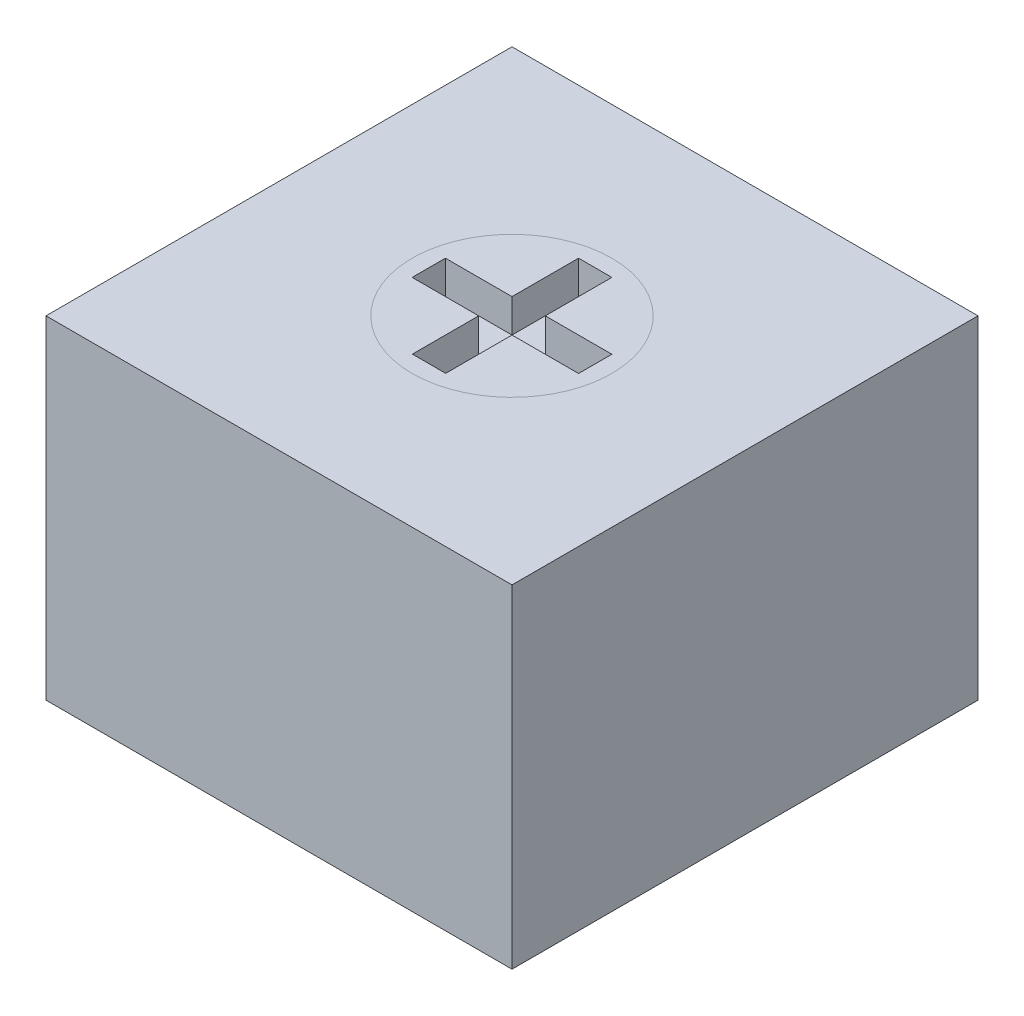
ISO-10303-21;
HEADER;
FILE_DESCRIPTION(('STEP AP214'),'2;1');
FILE_NAME('part.step','',(''),(''),'','','');
FILE_SCHEMA(('AUTOMOTIVE_DESIGN { 1 0 10303 214 1 1 1 1 }'));
ENDSEC;
DATA;
#1=APPLICATION_CONTEXT('core data for automotive mechanical design processes');
#2=APPLICATION_PROTOCOL_DEFINITION('international standard','automotive_design',2000,#1);
#3=PRODUCT_CONTEXT('',#1,'mechanical');
#4=PRODUCT('Part','Part','',(#3));
#5=PRODUCT_RELATED_PRODUCT_CATEGORY('part','',(#4));
#6=PRODUCT_DEFINITION_FORMATION('','',#4);
#7=PRODUCT_DEFINITION_CONTEXT('part definition',#1,'design');
#8=PRODUCT_DEFINITION('design','',#6,#7);
#9=PRODUCT_DEFINITION_SHAPE('','',#8);
#10=(LENGTH_UNIT() NAMED_UNIT(*) SI_UNIT(.MILLI.,.METRE.));
#11=(NAMED_UNIT(*) PLANE_ANGLE_UNIT() SI_UNIT($,.RADIAN.));
#12=(NAMED_UNIT(*) SI_UNIT($,.STERADIAN.) SOLID_ANGLE_UNIT());
#13=UNCERTAINTY_MEASURE_WITH_UNIT(LENGTH_MEASURE(1.E-05),#10,'distance_accuracy_value','');
#14=(GEOMETRIC_REPRESENTATION_CONTEXT(3) GLOBAL_UNCERTAINTY_ASSIGNED_CONTEXT((#13)) GLOBAL_UNIT_ASSIGNED_CONTEXT((#10,
#11,#12)) REPRESENTATION_CONTEXT('',''));
#15=CARTESIAN_POINT('',(0.,0.,0.));
#16=DIRECTION('',(0.,0.,1.));
#17=DIRECTION('',(1.,0.,0.));
#18=AXIS2_PLACEMENT_3D('',#15,#16,#17);
#19=CARTESIAN_POINT('',(-16.3383821392358,5.,-14.0400329889584));
#20=DIRECTION('',(0.,-1.,0.));
#21=DIRECTION('',(0.,0.,-1.));
#22=AXIS2_PLACEMENT_3D('',#19,#20,#21);
#23=CYLINDRICAL_SURFACE('',#22,1.5);
#24=CARTESIAN_POINT('',(-16.3383821392358,5.,-14.0400329889584));
#25=DIRECTION('',(0.,1.,0.));
#26=DIRECTION('',(0.,0.,1.));
#27=AXIS2_PLACEMENT_3D('',#24,#25,#26);
#28=CIRCLE('',#27,1.5);
#29=CARTESIAN_POINT('',(-16.3383821392358,5.,-12.5400329889584));
#30=VERTEX_POINT('',#29);
#31=EDGE_CURVE('E12',#30,#30,#28,.T.);
#32=ORIENTED_EDGE('',*,*,#31,.F.);
#33=EDGE_LOOP('',(#32));
#34=FACE_BOUND('',#33,.T.);
#35=CARTESIAN_POINT('',(-16.3383821392358,2.,-14.0400329889584));
#36=DIRECTION('',(0.,1.,0.));
#37=DIRECTION('',(0.,0.,1.));
#38=AXIS2_PLACEMENT_3D('',#35,#36,#37);
#39=CIRCLE('',#38,1.5);
#40=CARTESIAN_POINT('',(-16.3383821392358,2.,-12.5400329889584));
#41=VERTEX_POINT('',#40);
#42=EDGE_CURVE('E54',#41,#41,#39,.T.);
#43=ORIENTED_EDGE('',*,*,#42,.T.);
#44=EDGE_LOOP('',(#43));
#45=FACE_BOUND('',#44,.T.);
#46=ADVANCED_FACE('F51',(#34,#45),#23,.T.);
#47=CARTESIAN_POINT('',(-16.3383821392358,5.,-14.0400329889584));
#48=DIRECTION('',(0.,1.,0.));
#49=DIRECTION('',(0.,0.,1.));
#50=AXIS2_PLACEMENT_3D('',#47,#48,#49);
#51=PLANE('',#50);
#52=DIRECTION('',(0.,0.,1.));
#53=VECTOR('',#52,1.);
#54=CARTESIAN_POINT('',(-17.5883821392358,5.,-14.2900329889584));
#55=LINE('',#54,#53);
#56=CARTESIAN_POINT('',(-17.5883821392358,5.,-14.2900329889584));
#57=VERTEX_POINT('',#56);
#58=CARTESIAN_POINT('',(-17.5883821392358,5.,-13.7900329889584));
#59=VERTEX_POINT('',#58);
#60=EDGE_CURVE('E65',#57,#59,#55,.T.);
#61=ORIENTED_EDGE('',*,*,#60,.F.);
#62=DIRECTION('',(-1.,0.,0.));
#63=VECTOR('',#62,1.);
#64=CARTESIAN_POINT('',(-17.5883821392358,5.,-14.2900329889584));
#65=LINE('',#64,#63);
#66=CARTESIAN_POINT('',(-16.5883821392358,5.,-14.2900329889584));
#67=VERTEX_POINT('',#66);
#68=EDGE_CURVE('E202',#67,#57,#65,.T.);
#69=ORIENTED_EDGE('',*,*,#68,.F.);
#70=DIRECTION('',(0.,0.,1.));
#71=VECTOR('',#70,1.);
#72=CARTESIAN_POINT('',(-16.5883821392358,5.,-15.2900329889584));
#73=LINE('',#72,#71);
#74=CARTESIAN_POINT('',(-16.5883821392358,5.,-15.2900329889584));
#75=VERTEX_POINT('',#74);
#76=EDGE_CURVE('E200',#75,#67,#73,.T.);
#77=ORIENTED_EDGE('',*,*,#76,.F.);
#78=DIRECTION('',(-1.,0.,0.));
#79=VECTOR('',#78,1.);
#80=CARTESIAN_POINT('',(-16.5883821392358,5.,-15.2900329889584));
#81=LINE('',#80,#79);
#82=CARTESIAN_POINT('',(-16.0883821392358,5.,-15.2900329889584));
#83=VERTEX_POINT('',#82);
#84=EDGE_CURVE('E149',#83,#75,#81,.T.);
#85=ORIENTED_EDGE('',*,*,#84,.F.);
#86=DIRECTION('',(0.,0.,-1.));
#87=VECTOR('',#86,1.);
#88=CARTESIAN_POINT('',(-16.0883821392358,5.,-15.2900329889584));
#89=LINE('',#88,#87);
#90=CARTESIAN_POINT('',(-16.0883821392358,5.,-14.2900329889584));
#91=VERTEX_POINT('',#90);
#92=EDGE_CURVE('E196',#91,#83,#89,.T.);
#93=ORIENTED_EDGE('',*,*,#92,.F.);
#94=DIRECTION('',(-1.,0.,0.));
#95=VECTOR('',#94,1.);
#96=CARTESIAN_POINT('',(-16.0883821392358,5.,-14.2900329889584));
#97=LINE('',#96,#95);
#98=CARTESIAN_POINT('',(-15.0883821392358,5.,-14.2900329889584));
#99=VERTEX_POINT('',#98);
#100=EDGE_CURVE('E193',#99,#91,#97,.T.);
#101=ORIENTED_EDGE('',*,*,#100,.F.);
#102=DIRECTION('',(0.,0.,-1.));
#103=VECTOR('',#102,1.);
#104=CARTESIAN_POINT('',(-15.0883821392358,5.,-14.2900329889584));
#105=LINE('',#104,#103);
#106=CARTESIAN_POINT('',(-15.0883821392358,5.,-13.7900329889584));
#107=VERTEX_POINT('',#106);
#108=EDGE_CURVE('E190',#107,#99,#105,.T.);
#109=ORIENTED_EDGE('',*,*,#108,.F.);
#110=DIRECTION('',(1.,0.,0.));
#111=VECTOR('',#110,1.);
#112=CARTESIAN_POINT('',(-16.0883821392358,5.,-13.7900329889584));
#113=LINE('',#112,#111);
#114=CARTESIAN_POINT('',(-16.0883821392358,5.,-13.7900329889584));
#115=VERTEX_POINT('',#114);
#116=EDGE_CURVE('E187',#115,#107,#113,.T.);
#117=ORIENTED_EDGE('',*,*,#116,.F.);
#118=DIRECTION('',(0.,0.,-1.));
#119=VECTOR('',#118,1.);
#120=CARTESIAN_POINT('',(-16.0883821392358,5.,-13.7900329889584));
#121=LINE('',#120,#119);
#122=CARTESIAN_POINT('',(-16.0883821392358,5.,-12.7938401704171));
#123=VERTEX_POINT('',#122);
#124=EDGE_CURVE('E184',#123,#115,#121,.T.);
#125=ORIENTED_EDGE('',*,*,#124,.F.);
#126=DIRECTION('',(1.,0.,0.));
#127=VECTOR('',#126,1.);
#128=CARTESIAN_POINT('',(-16.5883821392358,5.,-12.7938401704171));
#129=LINE('',#128,#127);
#130=CARTESIAN_POINT('',(-16.5883821392358,5.,-12.7938401704171));
#131=VERTEX_POINT('',#130);
#132=EDGE_CURVE('E181',#131,#123,#129,.T.);
#133=ORIENTED_EDGE('',*,*,#132,.F.);
#134=DIRECTION('',(0.,0.,1.));
#135=VECTOR('',#134,1.);
#136=CARTESIAN_POINT('',(-16.5883821392358,5.,-13.7900329889584));
#137=LINE('',#136,#135);
#138=CARTESIAN_POINT('',(-16.5883821392358,5.,-13.7900329889584));
#139=VERTEX_POINT('',#138);
#140=EDGE_CURVE('E178',#139,#131,#137,.T.);
#141=ORIENTED_EDGE('',*,*,#140,.F.);
#142=DIRECTION('',(1.,0.,0.));
#143=VECTOR('',#142,1.);
#144=CARTESIAN_POINT('',(-17.5883821392358,5.,-13.7900329889584));
#145=LINE('',#144,#143);
#146=EDGE_CURVE('E175',#59,#139,#145,.T.);
#147=ORIENTED_EDGE('',*,*,#146,.F.);
#148=EDGE_LOOP('',(#61,#69,#77,#85,#93,#101,#109,#117,#125,#133,#141,#147));
#149=FACE_BOUND('',#148,.T.);
#150=ORIENTED_EDGE('',*,*,#31,.T.);
#151=EDGE_LOOP('',(#150));
#152=FACE_BOUND('',#151,.T.);
#153=ADVANCED_FACE('F229',(#149,#152),#51,.T.);
#154=CARTESIAN_POINT('',(-16.3383821392358,2.,-14.0400329889584));
#155=DIRECTION('',(0.,1.,0.));
#156=DIRECTION('',(0.,0.,1.));
#157=AXIS2_PLACEMENT_3D('',#154,#155,#156);
#158=PLANE('',#157);
#159=ORIENTED_EDGE('',*,*,#42,.F.);
#160=EDGE_LOOP('',(#159));
#161=FACE_BOUND('',#160,.T.);
#162=ADVANCED_FACE('F272',(#161),#158,.F.);
#163=CARTESIAN_POINT('',(-17.5883821392358,4.5,-14.2900329889584));
#164=DIRECTION('',(-1.,0.,0.));
#165=DIRECTION('',(0.,0.,1.));
#166=AXIS2_PLACEMENT_3D('',#163,#164,#165);
#167=PLANE('',#166);
#168=ORIENTED_EDGE('',*,*,#60,.T.);
#169=DIRECTION('',(0.,1.,0.));
#170=VECTOR('',#169,1.);
#171=CARTESIAN_POINT('',(-17.5883821392358,4.5,-13.7900329889584));
#172=LINE('',#171,#170);
#173=CARTESIAN_POINT('',(-17.5883821392358,4.5,-13.7900329889584));
#174=VERTEX_POINT('',#173);
#175=EDGE_CURVE('E113',#174,#59,#172,.T.);
#176=ORIENTED_EDGE('',*,*,#175,.F.);
#177=DIRECTION('',(0.,0.,1.));
#178=VECTOR('',#177,1.);
#179=CARTESIAN_POINT('',(-17.5883821392358,4.5,-14.2900329889584));
#180=LINE('',#179,#178);
#181=CARTESIAN_POINT('',(-17.5883821392358,4.5,-14.2900329889584));
#182=VERTEX_POINT('',#181);
#183=EDGE_CURVE('E204',#182,#174,#180,.T.);
#184=ORIENTED_EDGE('',*,*,#183,.F.);
#185=DIRECTION('',(0.,1.,0.));
#186=VECTOR('',#185,1.);
#187=CARTESIAN_POINT('',(-17.5883821392358,4.5,-14.2900329889584));
#188=LINE('',#187,#186);
#189=EDGE_CURVE('E73',#182,#57,#188,.T.);
#190=ORIENTED_EDGE('',*,*,#189,.T.);
#191=EDGE_LOOP('',(#168,#176,#184,#190));
#192=FACE_BOUND('',#191,.T.);
#193=ADVANCED_FACE('F265',(#192),#167,.F.);
#194=CARTESIAN_POINT('',(-17.5883821392358,4.5,-14.2900329889584));
#195=DIRECTION('',(0.,0.,-1.));
#196=DIRECTION('',(-1.,0.,0.));
#197=AXIS2_PLACEMENT_3D('',#194,#195,#196);
#198=PLANE('',#197);
#199=ORIENTED_EDGE('',*,*,#68,.T.);
#200=ORIENTED_EDGE('',*,*,#189,.F.);
#201=DIRECTION('',(-1.,0.,0.));
#202=VECTOR('',#201,1.);
#203=CARTESIAN_POINT('',(-17.5883821392358,4.5,-14.2900329889584));
#204=LINE('',#203,#202);
#205=CARTESIAN_POINT('',(-16.5883821392358,4.5,-14.2900329889584));
#206=VERTEX_POINT('',#205);
#207=EDGE_CURVE('E161',#206,#182,#204,.T.);
#208=ORIENTED_EDGE('',*,*,#207,.F.);
#209=DIRECTION('',(0.,1.,0.));
#210=VECTOR('',#209,1.);
#211=CARTESIAN_POINT('',(-16.5883821392358,4.5,-14.2900329889584));
#212=LINE('',#211,#210);
#213=EDGE_CURVE('E153',#206,#67,#212,.T.);
#214=ORIENTED_EDGE('',*,*,#213,.T.);
#215=EDGE_LOOP('',(#199,#200,#208,#214));
#216=FACE_BOUND('',#215,.T.);
#217=ADVANCED_FACE('F263',(#216),#198,.F.);
#218=CARTESIAN_POINT('',(-16.5883821392358,4.5,-15.2900329889584));
#219=DIRECTION('',(-1.,0.,0.));
#220=DIRECTION('',(0.,0.,1.));
#221=AXIS2_PLACEMENT_3D('',#218,#219,#220);
#222=PLANE('',#221);
#223=ORIENTED_EDGE('',*,*,#76,.T.);
#224=ORIENTED_EDGE('',*,*,#213,.F.);
#225=DIRECTION('',(0.,0.,1.));
#226=VECTOR('',#225,1.);
#227=CARTESIAN_POINT('',(-16.5883821392358,4.5,-15.2900329889584));
#228=LINE('',#227,#226);
#229=CARTESIAN_POINT('',(-16.5883821392358,4.5,-15.2900329889584));
#230=VERTEX_POINT('',#229);
#231=EDGE_CURVE('E157',#230,#206,#228,.T.);
#232=ORIENTED_EDGE('',*,*,#231,.F.);
#233=DIRECTION('',(0.,1.,0.));
#234=VECTOR('',#233,1.);
#235=CARTESIAN_POINT('',(-16.5883821392358,4.5,-15.2900329889584));
#236=LINE('',#235,#234);
#237=EDGE_CURVE('E142',#230,#75,#236,.T.);
#238=ORIENTED_EDGE('',*,*,#237,.T.);
#239=EDGE_LOOP('',(#223,#224,#232,#238));
#240=FACE_BOUND('',#239,.T.);
#241=ADVANCED_FACE('F158',(#240),#222,.F.);
#242=CARTESIAN_POINT('',(-16.5883821392358,4.5,-15.2900329889584));
#243=DIRECTION('',(0.,0.,-1.));
#244=DIRECTION('',(-1.,0.,0.));
#245=AXIS2_PLACEMENT_3D('',#242,#243,#244);
#246=PLANE('',#245);
#247=ORIENTED_EDGE('',*,*,#84,.T.);
#248=ORIENTED_EDGE('',*,*,#237,.F.);
#249=DIRECTION('',(-1.,0.,0.));
#250=VECTOR('',#249,1.);
#251=CARTESIAN_POINT('',(-16.5883821392358,4.5,-15.2900329889584));
#252=LINE('',#251,#250);
#253=CARTESIAN_POINT('',(-16.0883821392358,4.5,-15.2900329889584));
#254=VERTEX_POINT('',#253);
#255=EDGE_CURVE('E146',#254,#230,#252,.T.);
#256=ORIENTED_EDGE('',*,*,#255,.F.);
#257=DIRECTION('',(0.,1.,0.));
#258=VECTOR('',#257,1.);
#259=CARTESIAN_POINT('',(-16.0883821392358,4.5,-15.2900329889584));
#260=LINE('',#259,#258);
#261=EDGE_CURVE('E154',#254,#83,#260,.T.);
#262=ORIENTED_EDGE('',*,*,#261,.T.);
#263=EDGE_LOOP('',(#247,#248,#256,#262));
#264=FACE_BOUND('',#263,.T.);
#265=ADVANCED_FACE('F144',(#264),#246,.F.);
#266=CARTESIAN_POINT('',(-16.0883821392358,4.5,-15.2900329889584));
#267=DIRECTION('',(1.,0.,0.));
#268=DIRECTION('',(0.,0.,-1.));
#269=AXIS2_PLACEMENT_3D('',#266,#267,#268);
#270=PLANE('',#269);
#271=ORIENTED_EDGE('',*,*,#92,.T.);
#272=ORIENTED_EDGE('',*,*,#261,.F.);
#273=DIRECTION('',(0.,0.,-1.));
#274=VECTOR('',#273,1.);
#275=CARTESIAN_POINT('',(-16.0883821392358,4.5,-15.2900329889584));
#276=LINE('',#275,#274);
#277=CARTESIAN_POINT('',(-16.0883821392358,4.5,-14.2900329889584));
#278=VERTEX_POINT('',#277);
#279=EDGE_CURVE('E167',#278,#254,#276,.T.);
#280=ORIENTED_EDGE('',*,*,#279,.F.);
#281=DIRECTION('',(0.,1.,0.));
#282=VECTOR('',#281,1.);
#283=CARTESIAN_POINT('',(-16.0883821392358,4.5,-14.2900329889584));
#284=LINE('',#283,#282);
#285=EDGE_CURVE('E208',#278,#91,#284,.T.);
#286=ORIENTED_EDGE('',*,*,#285,.T.);
#287=EDGE_LOOP('',(#271,#272,#280,#286));
#288=FACE_BOUND('',#287,.T.);
#289=ADVANCED_FACE('F262',(#288),#270,.F.);
#290=CARTESIAN_POINT('',(-16.0883821392358,4.5,-14.2900329889584));
#291=DIRECTION('',(0.,0.,-1.));
#292=DIRECTION('',(-1.,0.,0.));
#293=AXIS2_PLACEMENT_3D('',#290,#291,#292);
#294=PLANE('',#293);
#295=ORIENTED_EDGE('',*,*,#100,.T.);
#296=ORIENTED_EDGE('',*,*,#285,.F.);
#297=DIRECTION('',(-1.,0.,0.));
#298=VECTOR('',#297,1.);
#299=CARTESIAN_POINT('',(-16.0883821392358,4.5,-14.2900329889584));
#300=LINE('',#299,#298);
#301=CARTESIAN_POINT('',(-15.0883821392358,4.5,-14.2900329889584));
#302=VERTEX_POINT('',#301);
#303=EDGE_CURVE('E169',#302,#278,#300,.T.);
#304=ORIENTED_EDGE('',*,*,#303,.F.);
#305=DIRECTION('',(0.,1.,0.));
#306=VECTOR('',#305,1.);
#307=CARTESIAN_POINT('',(-15.0883821392358,4.5,-14.2900329889584));
#308=LINE('',#307,#306);
#309=EDGE_CURVE('E210',#302,#99,#308,.T.);
#310=ORIENTED_EDGE('',*,*,#309,.T.);
#311=EDGE_LOOP('',(#295,#296,#304,#310));
#312=FACE_BOUND('',#311,.T.);
#313=ADVANCED_FACE('F258',(#312),#294,.F.);
#314=CARTESIAN_POINT('',(-15.0883821392358,4.5,-14.2900329889584));
#315=DIRECTION('',(1.,0.,0.));
#316=DIRECTION('',(0.,0.,-1.));
#317=AXIS2_PLACEMENT_3D('',#314,#315,#316);
#318=PLANE('',#317);
#319=ORIENTED_EDGE('',*,*,#108,.T.);
#320=ORIENTED_EDGE('',*,*,#309,.F.);
#321=DIRECTION('',(0.,0.,-1.));
#322=VECTOR('',#321,1.);
#323=CARTESIAN_POINT('',(-15.0883821392358,4.5,-14.2900329889584));
#324=LINE('',#323,#322);
#325=CARTESIAN_POINT('',(-15.0883821392358,4.5,-13.7900329889584));
#326=VERTEX_POINT('',#325);
#327=EDGE_CURVE('E253',#326,#302,#324,.T.);
#328=ORIENTED_EDGE('',*,*,#327,.F.);
#329=DIRECTION('',(0.,1.,0.));
#330=VECTOR('',#329,1.);
#331=CARTESIAN_POINT('',(-15.0883821392358,4.5,-13.7900329889584));
#332=LINE('',#331,#330);
#333=EDGE_CURVE('E212',#326,#107,#332,.T.);
#334=ORIENTED_EDGE('',*,*,#333,.T.);
#335=EDGE_LOOP('',(#319,#320,#328,#334));
#336=FACE_BOUND('',#335,.T.);
#337=ADVANCED_FACE('F305',(#336),#318,.F.);
#338=CARTESIAN_POINT('',(-16.0883821392358,4.5,-13.7900329889584));
#339=DIRECTION('',(0.,0.,1.));
#340=DIRECTION('',(1.,0.,0.));
#341=AXIS2_PLACEMENT_3D('',#338,#339,#340);
#342=PLANE('',#341);
#343=ORIENTED_EDGE('',*,*,#116,.T.);
#344=ORIENTED_EDGE('',*,*,#333,.F.);
#345=DIRECTION('',(1.,0.,0.));
#346=VECTOR('',#345,1.);
#347=CARTESIAN_POINT('',(-16.0883821392358,4.5,-13.7900329889584));
#348=LINE('',#347,#346);
#349=CARTESIAN_POINT('',(-16.0883821392358,4.5,-13.7900329889584));
#350=VERTEX_POINT('',#349);
#351=EDGE_CURVE('E250',#350,#326,#348,.T.);
#352=ORIENTED_EDGE('',*,*,#351,.F.);
#353=DIRECTION('',(0.,1.,0.));
#354=VECTOR('',#353,1.);
#355=CARTESIAN_POINT('',(-16.0883821392358,4.5,-13.7900329889584));
#356=LINE('',#355,#354);
#357=EDGE_CURVE('E214',#350,#115,#356,.T.);
#358=ORIENTED_EDGE('',*,*,#357,.T.);
#359=EDGE_LOOP('',(#343,#344,#352,#358));
#360=FACE_BOUND('',#359,.T.);
#361=ADVANCED_FACE('F301',(#360),#342,.F.);
#362=CARTESIAN_POINT('',(-16.0883821392358,4.5,-13.7900329889584));
#363=DIRECTION('',(1.,0.,0.));
#364=DIRECTION('',(0.,0.,-1.));
#365=AXIS2_PLACEMENT_3D('',#362,#363,#364);
#366=PLANE('',#365);
#367=ORIENTED_EDGE('',*,*,#124,.T.);
#368=ORIENTED_EDGE('',*,*,#357,.F.);
#369=DIRECTION('',(0.,0.,-1.));
#370=VECTOR('',#369,1.);
#371=CARTESIAN_POINT('',(-16.0883821392358,4.5,-13.7900329889584));
#372=LINE('',#371,#370);
#373=CARTESIAN_POINT('',(-16.0883821392358,4.5,-12.7938401704171));
#374=VERTEX_POINT('',#373);
#375=EDGE_CURVE('E247',#374,#350,#372,.T.);
#376=ORIENTED_EDGE('',*,*,#375,.F.);
#377=DIRECTION('',(0.,1.,0.));
#378=VECTOR('',#377,1.);
#379=CARTESIAN_POINT('',(-16.0883821392358,4.5,-12.7938401704171));
#380=LINE('',#379,#378);
#381=EDGE_CURVE('E216',#374,#123,#380,.T.);
#382=ORIENTED_EDGE('',*,*,#381,.T.);
#383=EDGE_LOOP('',(#367,#368,#376,#382));
#384=FACE_BOUND('',#383,.T.);
#385=ADVANCED_FACE('F297',(#384),#366,.F.);
#386=CARTESIAN_POINT('',(-16.5883821392358,4.5,-12.7938401704171));
#387=DIRECTION('',(0.,0.,1.));
#388=DIRECTION('',(1.,0.,0.));
#389=AXIS2_PLACEMENT_3D('',#386,#387,#388);
#390=PLANE('',#389);
#391=ORIENTED_EDGE('',*,*,#132,.T.);
#392=ORIENTED_EDGE('',*,*,#381,.F.);
#393=DIRECTION('',(1.,0.,0.));
#394=VECTOR('',#393,1.);
#395=CARTESIAN_POINT('',(-16.5883821392358,4.5,-12.7938401704171));
#396=LINE('',#395,#394);
#397=CARTESIAN_POINT('',(-16.5883821392358,4.5,-12.7938401704171));
#398=VERTEX_POINT('',#397);
#399=EDGE_CURVE('E241',#398,#374,#396,.T.);
#400=ORIENTED_EDGE('',*,*,#399,.F.);
#401=DIRECTION('',(0.,1.,0.));
#402=VECTOR('',#401,1.);
#403=CARTESIAN_POINT('',(-16.5883821392358,4.5,-12.7938401704171));
#404=LINE('',#403,#402);
#405=EDGE_CURVE('E218',#398,#131,#404,.T.);
#406=ORIENTED_EDGE('',*,*,#405,.T.);
#407=EDGE_LOOP('',(#391,#392,#400,#406));
#408=FACE_BOUND('',#407,.T.);
#409=ADVANCED_FACE('F294',(#408),#390,.F.);
#410=CARTESIAN_POINT('',(-16.5883821392358,4.5,-13.7900329889584));
#411=DIRECTION('',(-1.,0.,0.));
#412=DIRECTION('',(0.,0.,1.));
#413=AXIS2_PLACEMENT_3D('',#410,#411,#412);
#414=PLANE('',#413);
#415=ORIENTED_EDGE('',*,*,#140,.T.);
#416=ORIENTED_EDGE('',*,*,#405,.F.);
#417=DIRECTION('',(0.,0.,1.));
#418=VECTOR('',#417,1.);
#419=CARTESIAN_POINT('',(-16.5883821392358,4.5,-13.7900329889584));
#420=LINE('',#419,#418);
#421=CARTESIAN_POINT('',(-16.5883821392358,4.5,-13.7900329889584));
#422=VERTEX_POINT('',#421);
#423=EDGE_CURVE('E239',#422,#398,#420,.T.);
#424=ORIENTED_EDGE('',*,*,#423,.F.);
#425=DIRECTION('',(0.,1.,0.));
#426=VECTOR('',#425,1.);
#427=CARTESIAN_POINT('',(-16.5883821392358,4.5,-13.7900329889584));
#428=LINE('',#427,#426);
#429=EDGE_CURVE('E220',#422,#139,#428,.T.);
#430=ORIENTED_EDGE('',*,*,#429,.T.);
#431=EDGE_LOOP('',(#415,#416,#424,#430));
#432=FACE_BOUND('',#431,.T.);
#433=ADVANCED_FACE('F235',(#432),#414,.F.);
#434=CARTESIAN_POINT('',(-17.5883821392358,4.5,-13.7900329889584));
#435=DIRECTION('',(0.,0.,1.));
#436=DIRECTION('',(1.,0.,0.));
#437=AXIS2_PLACEMENT_3D('',#434,#435,#436);
#438=PLANE('',#437);
#439=ORIENTED_EDGE('',*,*,#146,.T.);
#440=ORIENTED_EDGE('',*,*,#429,.F.);
#441=DIRECTION('',(1.,0.,0.));
#442=VECTOR('',#441,1.);
#443=CARTESIAN_POINT('',(-17.5883821392358,4.5,-13.7900329889584));
#444=LINE('',#443,#442);
#445=EDGE_CURVE('E227',#174,#422,#444,.T.);
#446=ORIENTED_EDGE('',*,*,#445,.F.);
#447=ORIENTED_EDGE('',*,*,#175,.T.);
#448=EDGE_LOOP('',(#439,#440,#446,#447));
#449=FACE_BOUND('',#448,.T.);
#450=ADVANCED_FACE('F224',(#449),#438,.F.);
#451=CARTESIAN_POINT('',(0.,4.5,0.));
#452=DIRECTION('',(0.,1.,0.));
#453=DIRECTION('',(0.,0.,1.));
#454=AXIS2_PLACEMENT_3D('',#451,#452,#453);
#455=PLANE('',#454);
#456=ORIENTED_EDGE('',*,*,#183,.T.);
#457=ORIENTED_EDGE('',*,*,#445,.T.);
#458=ORIENTED_EDGE('',*,*,#423,.T.);
#459=ORIENTED_EDGE('',*,*,#399,.T.);
#460=ORIENTED_EDGE('',*,*,#375,.T.);
#461=ORIENTED_EDGE('',*,*,#351,.T.);
#462=ORIENTED_EDGE('',*,*,#327,.T.);
#463=ORIENTED_EDGE('',*,*,#303,.T.);
#464=ORIENTED_EDGE('',*,*,#279,.T.);
#465=ORIENTED_EDGE('',*,*,#255,.T.);
#466=ORIENTED_EDGE('',*,*,#231,.T.);
#467=ORIENTED_EDGE('',*,*,#207,.T.);
#468=EDGE_LOOP('',(#456,#457,#458,#459,#460,#461,#462,#463,#464,#465,#466,#467));
#469=FACE_BOUND('',#468,.T.);
#470=ADVANCED_FACE('F164',(#469),#455,.T.);
#471=CLOSED_SHELL('',(#46,#153,#162,#193,#217,#241,#265,#289,#313,#337,#361,#385,#409,#433,#450,#470));
#472=MANIFOLD_SOLID_BREP('B2',#471);
#473=CARTESIAN_POINT('',(-19.8383821392358,5.,-17.5400329889584));
#474=DIRECTION('',(1.,0.,0.));
#475=DIRECTION('',(0.,0.,-1.));
#476=AXIS2_PLACEMENT_3D('',#473,#474,#475);
#477=PLANE('',#476);
#478=DIRECTION('',(0.,0.,1.));
#479=VECTOR('',#478,1.);
#480=CARTESIAN_POINT('',(-19.8383821392358,0.,-17.5400329889584));
#481=LINE('',#480,#479);
#482=CARTESIAN_POINT('',(-19.8383821392358,0.,-17.5400329889584));
#483=VERTEX_POINT('',#482);
#484=CARTESIAN_POINT('',(-19.8383821392358,0.,-10.5400329889584));
#485=VERTEX_POINT('',#484);
#486=EDGE_CURVE('E481',#483,#485,#481,.T.);
#487=ORIENTED_EDGE('',*,*,#486,.T.);
#488=DIRECTION('',(0.,-1.,0.));
#489=VECTOR('',#488,1.);
#490=CARTESIAN_POINT('',(-19.8383821392358,5.,-10.5400329889584));
#491=LINE('',#490,#489);
#492=CARTESIAN_POINT('',(-19.8383821392358,5.,-10.5400329889584));
#493=VERTEX_POINT('',#492);
#494=EDGE_CURVE('E49',#493,#485,#491,.T.);
#495=ORIENTED_EDGE('',*,*,#494,.F.);
#496=DIRECTION('',(0.,0.,1.));
#497=VECTOR('',#496,1.);
#498=CARTESIAN_POINT('',(-19.8383821392358,5.,-17.5400329889584));
#499=LINE('',#498,#497);
#500=CARTESIAN_POINT('',(-19.8383821392358,5.,-17.5400329889584));
#501=VERTEX_POINT('',#500);
#502=EDGE_CURVE('E465',#501,#493,#499,.T.);
#503=ORIENTED_EDGE('',*,*,#502,.F.);
#504=DIRECTION('',(0.,-1.,0.));
#505=VECTOR('',#504,1.);
#506=CARTESIAN_POINT('',(-19.8383821392358,5.,-17.5400329889584));
#507=LINE('',#506,#505);
#508=EDGE_CURVE('E477',#501,#483,#507,.T.);
#509=ORIENTED_EDGE('',*,*,#508,.T.);
#510=EDGE_LOOP('',(#487,#495,#503,#509));
#511=FACE_BOUND('',#510,.T.);
#512=ADVANCED_FACE('F413',(#511),#477,.F.);
#513=CARTESIAN_POINT('',(-19.8383821392358,5.,-10.5400329889584));
#514=DIRECTION('',(0.,0.,-1.));
#515=DIRECTION('',(-1.,0.,0.));
#516=AXIS2_PLACEMENT_3D('',#513,#514,#515);
#517=PLANE('',#516);
#518=DIRECTION('',(1.,0.,0.));
#519=VECTOR('',#518,1.);
#520=CARTESIAN_POINT('',(-19.8383821392358,0.,-10.5400329889584));
#521=LINE('',#520,#519);
#522=CARTESIAN_POINT('',(-12.8383821392358,0.,-10.5400329889584));
#523=VERTEX_POINT('',#522);
#524=EDGE_CURVE('E470',#485,#523,#521,.T.);
#525=ORIENTED_EDGE('',*,*,#524,.T.);
#526=DIRECTION('',(0.,-1.,0.));
#527=VECTOR('',#526,1.);
#528=CARTESIAN_POINT('',(-12.8383821392358,5.,-10.5400329889584));
#529=LINE('',#528,#527);
#530=CARTESIAN_POINT('',(-12.8383821392358,5.,-10.5400329889584));
#531=VERTEX_POINT('',#530);
#532=EDGE_CURVE('E422',#531,#523,#529,.T.);
#533=ORIENTED_EDGE('',*,*,#532,.F.);
#534=DIRECTION('',(1.,0.,0.));
#535=VECTOR('',#534,1.);
#536=CARTESIAN_POINT('',(-19.8383821392358,5.,-10.5400329889584));
#537=LINE('',#536,#535);
#538=EDGE_CURVE('E460',#493,#531,#537,.T.);
#539=ORIENTED_EDGE('',*,*,#538,.F.);
#540=ORIENTED_EDGE('',*,*,#494,.T.);
#541=EDGE_LOOP('',(#525,#533,#539,#540));
#542=FACE_BOUND('',#541,.T.);
#543=ADVANCED_FACE('F469',(#542),#517,.F.);
#544=CARTESIAN_POINT('',(-12.8383821392358,5.,-17.5400329889584));
#545=DIRECTION('',(-1.,0.,0.));
#546=DIRECTION('',(0.,0.,1.));
#547=AXIS2_PLACEMENT_3D('',#544,#545,#546);
#548=PLANE('',#547);
#549=DIRECTION('',(0.,0.,-1.));
#550=VECTOR('',#549,1.);
#551=CARTESIAN_POINT('',(-12.8383821392358,0.,-17.5400329889584));
#552=LINE('',#551,#550);
#553=CARTESIAN_POINT('',(-12.8383821392358,0.,-17.5400329889584));
#554=VERTEX_POINT('',#553);
#555=EDGE_CURVE('E447',#523,#554,#552,.T.);
#556=ORIENTED_EDGE('',*,*,#555,.T.);
#557=DIRECTION('',(0.,-1.,0.));
#558=VECTOR('',#557,1.);
#559=CARTESIAN_POINT('',(-12.8383821392358,5.,-17.5400329889584));
#560=LINE('',#559,#558);
#561=CARTESIAN_POINT('',(-12.8383821392358,5.,-17.5400329889584));
#562=VERTEX_POINT('',#561);
#563=EDGE_CURVE('E472',#562,#554,#560,.T.);
#564=ORIENTED_EDGE('',*,*,#563,.F.);
#565=DIRECTION('',(0.,0.,-1.));
#566=VECTOR('',#565,1.);
#567=CARTESIAN_POINT('',(-12.8383821392358,5.,-17.5400329889584));
#568=LINE('',#567,#566);
#569=EDGE_CURVE('E463',#531,#562,#568,.T.);
#570=ORIENTED_EDGE('',*,*,#569,.F.);
#571=ORIENTED_EDGE('',*,*,#532,.T.);
#572=EDGE_LOOP('',(#556,#564,#570,#571));
#573=FACE_BOUND('',#572,.T.);
#574=ADVANCED_FACE('F473',(#573),#548,.F.);
#575=CARTESIAN_POINT('',(-19.8383821392358,5.,-17.5400329889584));
#576=DIRECTION('',(0.,0.,1.));
#577=DIRECTION('',(1.,0.,0.));
#578=AXIS2_PLACEMENT_3D('',#575,#576,#577);
#579=PLANE('',#578);
#580=DIRECTION('',(-1.,0.,0.));
#581=VECTOR('',#580,1.);
#582=CARTESIAN_POINT('',(-19.8383821392358,0.,-17.5400329889584));
#583=LINE('',#582,#581);
#584=EDGE_CURVE('E453',#554,#483,#583,.T.);
#585=ORIENTED_EDGE('',*,*,#584,.T.);
#586=ORIENTED_EDGE('',*,*,#508,.F.);
#587=DIRECTION('',(-1.,0.,0.));
#588=VECTOR('',#587,1.);
#589=CARTESIAN_POINT('',(-19.8383821392358,5.,-17.5400329889584));
#590=LINE('',#589,#588);
#591=EDGE_CURVE('E430',#562,#501,#590,.T.);
#592=ORIENTED_EDGE('',*,*,#591,.F.);
#593=ORIENTED_EDGE('',*,*,#563,.T.);
#594=EDGE_LOOP('',(#585,#586,#592,#593));
#595=FACE_BOUND('',#594,.T.);
#596=ADVANCED_FACE('F495',(#595),#579,.F.);
#597=CARTESIAN_POINT('',(0.,5.,0.));
#598=DIRECTION('',(0.,1.,0.));
#599=DIRECTION('',(0.,0.,1.));
#600=AXIS2_PLACEMENT_3D('',#597,#598,#599);
#601=PLANE('',#600);
#602=CARTESIAN_POINT('',(-16.3383821392358,5.,-14.0400329889584));
#603=DIRECTION('',(0.,1.,0.));
#604=DIRECTION('',(0.,0.,1.));
#605=AXIS2_PLACEMENT_3D('',#602,#603,#604);
#606=CIRCLE('',#605,1.5);
#607=CARTESIAN_POINT('',(-16.3383821392358,5.,-12.5400329889584));
#608=VERTEX_POINT('',#607);
#609=EDGE_CURVE('E502',#608,#608,#606,.T.);
#610=ORIENTED_EDGE('',*,*,#609,.F.);
#611=EDGE_LOOP('',(#610));
#612=FACE_BOUND('',#611,.T.);
#613=ORIENTED_EDGE('',*,*,#502,.T.);
#614=ORIENTED_EDGE('',*,*,#538,.T.);
#615=ORIENTED_EDGE('',*,*,#569,.T.);
#616=ORIENTED_EDGE('',*,*,#591,.T.);
#617=EDGE_LOOP('',(#613,#614,#615,#616));
#618=FACE_BOUND('',#617,.T.);
#619=ADVANCED_FACE('F461',(#612,#618),#601,.T.);
#620=CARTESIAN_POINT('',(0.,0.,0.));
#621=DIRECTION('',(0.,1.,0.));
#622=DIRECTION('',(0.,0.,1.));
#623=AXIS2_PLACEMENT_3D('',#620,#621,#622);
#624=PLANE('',#623);
#625=ORIENTED_EDGE('',*,*,#486,.F.);
#626=ORIENTED_EDGE('',*,*,#584,.F.);
#627=ORIENTED_EDGE('',*,*,#555,.F.);
#628=ORIENTED_EDGE('',*,*,#524,.F.);
#629=EDGE_LOOP('',(#625,#626,#627,#628));
#630=FACE_BOUND('',#629,.T.);
#631=ADVANCED_FACE('F498',(#630),#624,.F.);
#632=CARTESIAN_POINT('',(-16.3383821392358,2.,-14.0400329889584));
#633=DIRECTION('',(0.,1.,0.));
#634=DIRECTION('',(0.,0.,1.));
#635=AXIS2_PLACEMENT_3D('',#632,#633,#634);
#636=CYLINDRICAL_SURFACE('',#635,1.5);
#637=CARTESIAN_POINT('',(-16.3383821392358,2.,-14.0400329889584));
#638=DIRECTION('',(0.,1.,0.));
#639=DIRECTION('',(0.,0.,1.));
#640=AXIS2_PLACEMENT_3D('',#637,#638,#639);
#641=CIRCLE('',#640,1.5);
#642=CARTESIAN_POINT('',(-16.3383821392358,2.,-12.5400329889584));
#643=VERTEX_POINT('',#642);
#644=EDGE_CURVE('E485',#643,#643,#641,.T.);
#645=ORIENTED_EDGE('',*,*,#644,.F.);
#646=EDGE_LOOP('',(#645));
#647=FACE_BOUND('',#646,.T.);
#648=ORIENTED_EDGE('',*,*,#609,.T.);
#649=EDGE_LOOP('',(#648));
#650=FACE_BOUND('',#649,.T.);
#651=ADVANCED_FACE('F512',(#647,#650),#636,.F.);
#652=CARTESIAN_POINT('',(-16.3383821392358,2.,-14.0400329889584));
#653=DIRECTION('',(0.,1.,0.));
#654=DIRECTION('',(0.,0.,1.));
#655=AXIS2_PLACEMENT_3D('',#652,#653,#654);
#656=PLANE('',#655);
#657=ORIENTED_EDGE('',*,*,#644,.T.);
#658=EDGE_LOOP('',(#657));
#659=FACE_BOUND('',#658,.T.);
#660=ADVANCED_FACE('F510',(#659),#656,.T.);
#661=CLOSED_SHELL('',(#512,#543,#574,#596,#619,#631,#651,#660));
#662=MANIFOLD_SOLID_BREP('B6',#661);
#663=ADVANCED_BREP_SHAPE_REPRESENTATION('',(#18,#472,#662),#14);
#664=SHAPE_DEFINITION_REPRESENTATION(#9,#663);
ENDSEC;
END-ISO-10303-21;
